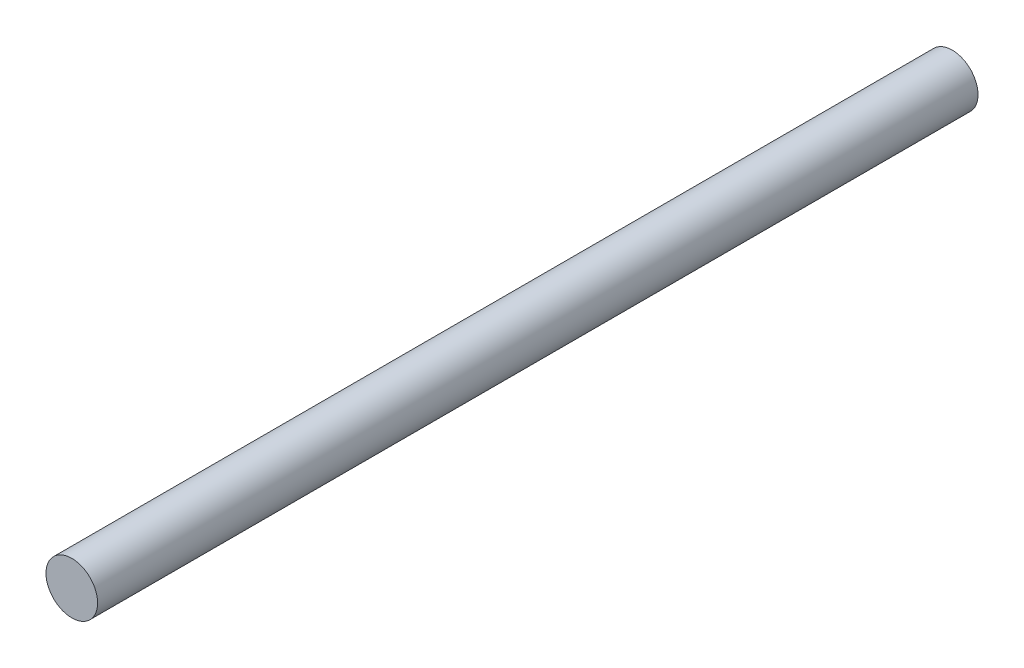
ISO-10303-21;
HEADER;
FILE_DESCRIPTION(('STEP AP214'),'2;1');
FILE_NAME('part.step','',(''),(''),'','','');
FILE_SCHEMA(('AUTOMOTIVE_DESIGN { 1 0 10303 214 1 1 1 1 }'));
ENDSEC;
DATA;
#1=APPLICATION_CONTEXT('core data for automotive mechanical design processes');
#2=APPLICATION_PROTOCOL_DEFINITION('international standard','automotive_design',2000,#1);
#3=PRODUCT_CONTEXT('',#1,'mechanical');
#4=PRODUCT('Part','Part','',(#3));
#5=PRODUCT_RELATED_PRODUCT_CATEGORY('part','',(#4));
#6=PRODUCT_DEFINITION_FORMATION('','',#4);
#7=PRODUCT_DEFINITION_CONTEXT('part definition',#1,'design');
#8=PRODUCT_DEFINITION('design','',#6,#7);
#9=PRODUCT_DEFINITION_SHAPE('','',#8);
#10=(LENGTH_UNIT() NAMED_UNIT(*) SI_UNIT(.MILLI.,.METRE.));
#11=(NAMED_UNIT(*) PLANE_ANGLE_UNIT() SI_UNIT($,.RADIAN.));
#12=(NAMED_UNIT(*) SI_UNIT($,.STERADIAN.) SOLID_ANGLE_UNIT());
#13=UNCERTAINTY_MEASURE_WITH_UNIT(LENGTH_MEASURE(1.E-05),#10,'distance_accuracy_value','');
#14=(GEOMETRIC_REPRESENTATION_CONTEXT(3) GLOBAL_UNCERTAINTY_ASSIGNED_CONTEXT((#13)) GLOBAL_UNIT_ASSIGNED_CONTEXT((#10,
#11,#12)) REPRESENTATION_CONTEXT('',''));
#15=CARTESIAN_POINT('',(0.,0.,0.));
#16=DIRECTION('',(0.,0.,1.));
#17=DIRECTION('',(1.,0.,0.));
#18=AXIS2_PLACEMENT_3D('',#15,#16,#17);
#19=CARTESIAN_POINT('',(0.,0.,37.5231047039901));
#20=DIRECTION('',(0.,0.,1.));
#21=DIRECTION('',(1.,0.,0.));
#22=AXIS2_PLACEMENT_3D('',#19,#20,#21);
#23=PLANE('',#22);
#24=CARTESIAN_POINT('',(0.,0.,37.5231047039901));
#25=DIRECTION('',(0.,0.,-1.));
#26=DIRECTION('',(-1.,0.,0.));
#27=AXIS2_PLACEMENT_3D('',#24,#25,#26);
#28=CIRCLE('',#27,2.2);
#29=CARTESIAN_POINT('',(-2.2,0.,37.5231047039901));
#30=VERTEX_POINT('',#29);
#31=EDGE_CURVE('E9',#30,#30,#28,.T.);
#32=ORIENTED_EDGE('',*,*,#31,.F.);
#33=EDGE_LOOP('',(#32));
#34=FACE_BOUND('',#33,.T.);
#35=ADVANCED_FACE('F14',(#34),#23,.T.);
#36=CARTESIAN_POINT('',(0.,0.,-37.5231047039901));
#37=DIRECTION('',(0.,0.,-1.));
#38=DIRECTION('',(-1.,0.,0.));
#39=AXIS2_PLACEMENT_3D('',#36,#37,#38);
#40=PLANE('',#39);
#41=CARTESIAN_POINT('',(0.,0.,-37.5231047039901));
#42=DIRECTION('',(0.,0.,1.));
#43=DIRECTION('',(1.,0.,0.));
#44=AXIS2_PLACEMENT_3D('',#41,#42,#43);
#45=CIRCLE('',#44,2.2);
#46=CARTESIAN_POINT('',(2.2,0.,-37.5231047039901));
#47=VERTEX_POINT('',#46);
#48=EDGE_CURVE('E21',#47,#47,#45,.T.);
#49=ORIENTED_EDGE('',*,*,#48,.F.);
#50=EDGE_LOOP('',(#49));
#51=FACE_BOUND('',#50,.T.);
#52=ADVANCED_FACE('F29',(#51),#40,.T.);
#53=CARTESIAN_POINT('',(0.,0.,-37.5231047039901));
#54=DIRECTION('',(0.,0.,1.));
#55=DIRECTION('',(1.,0.,0.));
#56=AXIS2_PLACEMENT_3D('',#53,#54,#55);
#57=CYLINDRICAL_SURFACE('',#56,2.2);
#58=ORIENTED_EDGE('',*,*,#31,.T.);
#59=EDGE_LOOP('',(#58));
#60=FACE_BOUND('',#59,.T.);
#61=ORIENTED_EDGE('',*,*,#48,.T.);
#62=EDGE_LOOP('',(#61));
#63=FACE_BOUND('',#62,.T.);
#64=ADVANCED_FACE('F16',(#60,#63),#57,.T.);
#65=CLOSED_SHELL('',(#35,#52,#64));
#66=MANIFOLD_SOLID_BREP('B1',#65);
#67=ADVANCED_BREP_SHAPE_REPRESENTATION('',(#18,#66),#14);
#68=SHAPE_DEFINITION_REPRESENTATION(#9,#67);
ENDSEC;
END-ISO-10303-21;
